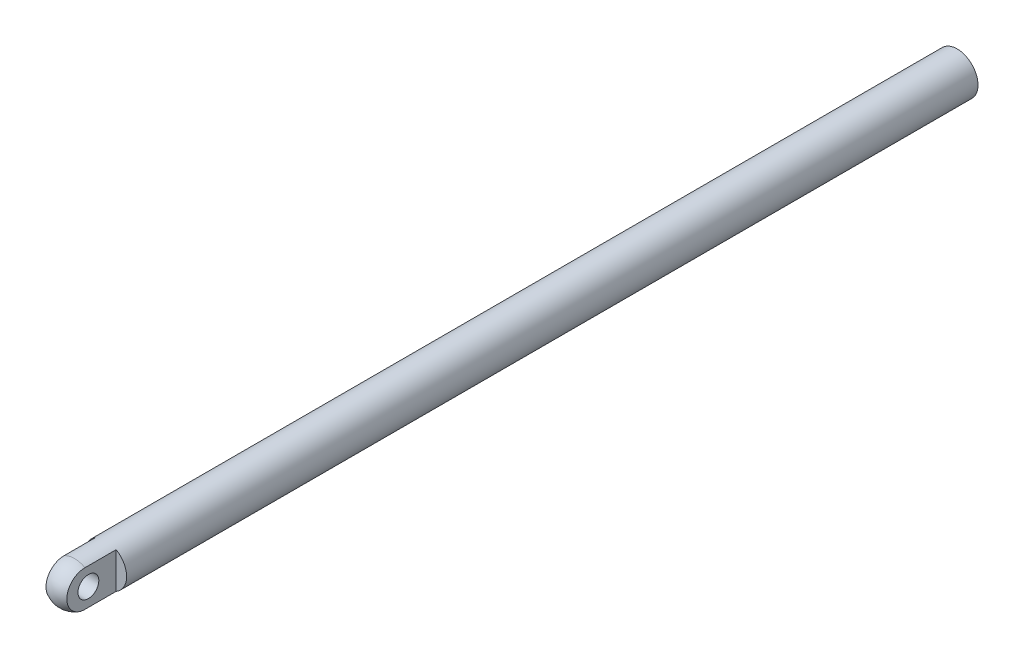
ISO-10303-21;
HEADER;
FILE_DESCRIPTION(('STEP AP214'),'2;1');
FILE_NAME('part.step','',(''),(''),'','','');
FILE_SCHEMA(('AUTOMOTIVE_DESIGN { 1 0 10303 214 1 1 1 1 }'));
ENDSEC;
DATA;
#1=APPLICATION_CONTEXT('core data for automotive mechanical design processes');
#2=APPLICATION_PROTOCOL_DEFINITION('international standard','automotive_design',2000,#1);
#3=PRODUCT_CONTEXT('',#1,'mechanical');
#4=PRODUCT('Part','Part','',(#3));
#5=PRODUCT_RELATED_PRODUCT_CATEGORY('part','',(#4));
#6=PRODUCT_DEFINITION_FORMATION('','',#4);
#7=PRODUCT_DEFINITION_CONTEXT('part definition',#1,'design');
#8=PRODUCT_DEFINITION('design','',#6,#7);
#9=PRODUCT_DEFINITION_SHAPE('','',#8);
#10=(LENGTH_UNIT() NAMED_UNIT(*) SI_UNIT(.MILLI.,.METRE.));
#11=(NAMED_UNIT(*) PLANE_ANGLE_UNIT() SI_UNIT($,.RADIAN.));
#12=(NAMED_UNIT(*) SI_UNIT($,.STERADIAN.) SOLID_ANGLE_UNIT());
#13=UNCERTAINTY_MEASURE_WITH_UNIT(LENGTH_MEASURE(1.E-05),#10,'distance_accuracy_value','');
#14=(GEOMETRIC_REPRESENTATION_CONTEXT(3) GLOBAL_UNCERTAINTY_ASSIGNED_CONTEXT((#13)) GLOBAL_UNIT_ASSIGNED_CONTEXT((#10,
#11,#12)) REPRESENTATION_CONTEXT('',''));
#15=CARTESIAN_POINT('',(0.,0.,0.));
#16=DIRECTION('',(0.,0.,1.));
#17=DIRECTION('',(1.,0.,0.));
#18=AXIS2_PLACEMENT_3D('',#15,#16,#17);
#19=CARTESIAN_POINT('',(0.,0.,897.));
#20=DIRECTION('',(0.,0.,-1.));
#21=DIRECTION('',(-1.,0.,0.));
#22=AXIS2_PLACEMENT_3D('',#19,#20,#21);
#23=CYLINDRICAL_SURFACE('',#22,20.7);
#24=DIRECTION('',(0.,0.,-1.));
#25=VECTOR('',#24,1.);
#26=CARTESIAN_POINT('',(10.35,-17.9267258583379,897.));
#27=LINE('',#26,#25);
#28=CARTESIAN_POINT('',(10.35,-17.9267258583379,845.25));
#29=VERTEX_POINT('',#28);
#30=CARTESIAN_POINT('',(10.35,-17.9267258583379,876.3));
#31=VERTEX_POINT('',#30);
#32=EDGE_CURVE('E82',#29,#31,#27,.F.);
#33=ORIENTED_EDGE('',*,*,#32,.T.);
#34=CARTESIAN_POINT('',(0.,0.,876.3));
#35=DIRECTION('',(0.,0.,-1.));
#36=DIRECTION('',(-1.,0.,0.));
#37=AXIS2_PLACEMENT_3D('',#34,#35,#36);
#38=CIRCLE('',#37,20.7);
#39=CARTESIAN_POINT('',(-10.35,-17.9267258583379,876.3));
#40=VERTEX_POINT('',#39);
#41=EDGE_CURVE('E111',#31,#40,#38,.T.);
#42=ORIENTED_EDGE('',*,*,#41,.T.);
#43=DIRECTION('',(0.,0.,-1.));
#44=VECTOR('',#43,1.);
#45=CARTESIAN_POINT('',(-10.35,-17.9267258583379,897.));
#46=LINE('',#45,#44);
#47=CARTESIAN_POINT('',(-10.35,-17.9267258583379,845.25));
#48=VERTEX_POINT('',#47);
#49=EDGE_CURVE('E103',#40,#48,#46,.T.);
#50=ORIENTED_EDGE('',*,*,#49,.T.);
#51=CARTESIAN_POINT('',(0.,0.,845.25));
#52=DIRECTION('',(0.,0.,1.));
#53=DIRECTION('',(1.,0.,0.));
#54=AXIS2_PLACEMENT_3D('',#51,#52,#53);
#55=CIRCLE('',#54,20.7);
#56=CARTESIAN_POINT('',(-10.35,17.9267258583379,845.25));
#57=VERTEX_POINT('',#56);
#58=EDGE_CURVE('E88',#57,#48,#55,.T.);
#59=ORIENTED_EDGE('',*,*,#58,.F.);
#60=DIRECTION('',(0.,0.,-1.));
#61=VECTOR('',#60,1.);
#62=CARTESIAN_POINT('',(-10.35,17.9267258583379,897.));
#63=LINE('',#62,#61);
#64=CARTESIAN_POINT('',(-10.35,17.9267258583379,876.3));
#65=VERTEX_POINT('',#64);
#66=EDGE_CURVE('E101',#57,#65,#63,.F.);
#67=ORIENTED_EDGE('',*,*,#66,.T.);
#68=CARTESIAN_POINT('',(0.,0.,876.3));
#69=DIRECTION('',(0.,0.,-1.));
#70=DIRECTION('',(-1.,0.,0.));
#71=AXIS2_PLACEMENT_3D('',#68,#69,#70);
#72=CIRCLE('',#71,20.7);
#73=CARTESIAN_POINT('',(10.35,17.9267258583379,876.3));
#74=VERTEX_POINT('',#73);
#75=EDGE_CURVE('E77',#65,#74,#72,.T.);
#76=ORIENTED_EDGE('',*,*,#75,.T.);
#77=DIRECTION('',(0.,0.,-1.));
#78=VECTOR('',#77,1.);
#79=CARTESIAN_POINT('',(10.35,17.9267258583379,897.));
#80=LINE('',#79,#78);
#81=CARTESIAN_POINT('',(10.35,17.9267258583379,845.25));
#82=VERTEX_POINT('',#81);
#83=EDGE_CURVE('E72',#74,#82,#80,.T.);
#84=ORIENTED_EDGE('',*,*,#83,.T.);
#85=CARTESIAN_POINT('',(0.,0.,845.25));
#86=DIRECTION('',(0.,0.,-1.));
#87=DIRECTION('',(-1.,0.,0.));
#88=AXIS2_PLACEMENT_3D('',#85,#86,#87);
#89=CIRCLE('',#88,20.7);
#90=EDGE_CURVE('E76',#82,#29,#89,.T.);
#91=ORIENTED_EDGE('',*,*,#90,.T.);
#92=EDGE_LOOP('',(#33,#42,#50,#59,#67,#76,#84,#91));
#93=FACE_BOUND('',#92,.T.);
#94=CARTESIAN_POINT('',(0.,0.,0.));
#95=DIRECTION('',(0.,0.,1.));
#96=DIRECTION('',(1.,0.,0.));
#97=AXIS2_PLACEMENT_3D('',#94,#95,#96);
#98=CIRCLE('',#97,20.7);
#99=CARTESIAN_POINT('',(20.7,0.,0.));
#100=VERTEX_POINT('',#99);
#101=EDGE_CURVE('E105',#100,#100,#98,.T.);
#102=ORIENTED_EDGE('',*,*,#101,.T.);
#103=EDGE_LOOP('',(#102));
#104=FACE_BOUND('',#103,.T.);
#105=ADVANCED_FACE('F33',(#93,#104),#23,.T.);
#106=CARTESIAN_POINT('',(0.,0.,0.));
#107=DIRECTION('',(0.,0.,1.));
#108=DIRECTION('',(1.,0.,0.));
#109=AXIS2_PLACEMENT_3D('',#106,#107,#108);
#110=PLANE('',#109);
#111=ORIENTED_EDGE('',*,*,#101,.F.);
#112=EDGE_LOOP('',(#111));
#113=FACE_BOUND('',#112,.T.);
#114=ADVANCED_FACE('F125',(#113),#110,.F.);
#115=CARTESIAN_POINT('',(0.,0.,845.25));
#116=DIRECTION('',(0.,0.,1.));
#117=DIRECTION('',(1.,0.,0.));
#118=AXIS2_PLACEMENT_3D('',#115,#116,#117);
#119=PLANE('',#118);
#120=ORIENTED_EDGE('',*,*,#58,.T.);
#121=DIRECTION('',(0.,1.,0.));
#122=VECTOR('',#121,1.);
#123=CARTESIAN_POINT('',(-10.35,20.7,845.25));
#124=LINE('',#123,#122);
#125=EDGE_CURVE('E81',#48,#57,#124,.T.);
#126=ORIENTED_EDGE('',*,*,#125,.T.);
#127=EDGE_LOOP('',(#120,#126));
#128=FACE_BOUND('',#127,.T.);
#129=ADVANCED_FACE('F116',(#128),#119,.T.);
#130=CARTESIAN_POINT('',(-10.35,20.7,845.25));
#131=DIRECTION('',(1.,0.,0.));
#132=DIRECTION('',(0.,0.,-1.));
#133=AXIS2_PLACEMENT_3D('',#130,#131,#132);
#134=PLANE('',#133);
#135=CARTESIAN_POINT('',(-10.35,0.,872.85));
#136=DIRECTION('',(1.,0.,0.));
#137=DIRECTION('',(0.,0.,-1.));
#138=AXIS2_PLACEMENT_3D('',#135,#136,#137);
#139=CIRCLE('',#138,10.3499999999999);
#140=CARTESIAN_POINT('',(-10.35,0.,862.5));
#141=VERTEX_POINT('',#140);
#142=EDGE_CURVE('E91',#141,#141,#139,.T.);
#143=ORIENTED_EDGE('',*,*,#142,.T.);
#144=EDGE_LOOP('',(#143));
#145=FACE_BOUND('',#144,.T.);
#146=ORIENTED_EDGE('',*,*,#49,.F.);
#147=CARTESIAN_POINT('',(-10.35,0.,876.3));
#148=DIRECTION('',(1.,0.,0.));
#149=DIRECTION('',(0.,0.,-1.));
#150=AXIS2_PLACEMENT_3D('',#147,#148,#149);
#151=CIRCLE('',#150,17.9267258583379);
#152=EDGE_CURVE('E41',#40,#65,#151,.F.);
#153=ORIENTED_EDGE('',*,*,#152,.T.);
#154=ORIENTED_EDGE('',*,*,#66,.F.);
#155=ORIENTED_EDGE('',*,*,#125,.F.);
#156=EDGE_LOOP('',(#146,#153,#154,#155));
#157=FACE_BOUND('',#156,.T.);
#158=ADVANCED_FACE('F114',(#145,#157),#134,.F.);
#159=CARTESIAN_POINT('',(0.,0.,845.25));
#160=DIRECTION('',(0.,0.,-1.));
#161=DIRECTION('',(-1.,0.,0.));
#162=AXIS2_PLACEMENT_3D('',#159,#160,#161);
#163=PLANE('',#162);
#164=DIRECTION('',(0.,-1.,0.));
#165=VECTOR('',#164,1.);
#166=CARTESIAN_POINT('',(10.35,20.7,845.25));
#167=LINE('',#166,#165);
#168=EDGE_CURVE('E87',#82,#29,#167,.T.);
#169=ORIENTED_EDGE('',*,*,#168,.T.);
#170=ORIENTED_EDGE('',*,*,#90,.F.);
#171=EDGE_LOOP('',(#169,#170));
#172=FACE_BOUND('',#171,.T.);
#173=ADVANCED_FACE('F86',(#172),#163,.F.);
#174=CARTESIAN_POINT('',(10.35,20.7,845.25));
#175=DIRECTION('',(-1.,0.,0.));
#176=DIRECTION('',(0.,0.,1.));
#177=AXIS2_PLACEMENT_3D('',#174,#175,#176);
#178=PLANE('',#177);
#179=CARTESIAN_POINT('',(10.35,0.,872.85));
#180=DIRECTION('',(1.,0.,0.));
#181=DIRECTION('',(0.,0.,-1.));
#182=AXIS2_PLACEMENT_3D('',#179,#180,#181);
#183=CIRCLE('',#182,10.3499999999999);
#184=CARTESIAN_POINT('',(10.35,0.,862.5));
#185=VERTEX_POINT('',#184);
#186=EDGE_CURVE('E95',#185,#185,#183,.T.);
#187=ORIENTED_EDGE('',*,*,#186,.F.);
#188=EDGE_LOOP('',(#187));
#189=FACE_BOUND('',#188,.T.);
#190=ORIENTED_EDGE('',*,*,#83,.F.);
#191=CARTESIAN_POINT('',(10.35,0.,876.3));
#192=DIRECTION('',(-1.,0.,0.));
#193=DIRECTION('',(0.,0.,1.));
#194=AXIS2_PLACEMENT_3D('',#191,#192,#193);
#195=CIRCLE('',#194,17.9267258583379);
#196=EDGE_CURVE('E11',#74,#31,#195,.F.);
#197=ORIENTED_EDGE('',*,*,#196,.T.);
#198=ORIENTED_EDGE('',*,*,#32,.F.);
#199=ORIENTED_EDGE('',*,*,#168,.F.);
#200=EDGE_LOOP('',(#190,#197,#198,#199));
#201=FACE_BOUND('',#200,.T.);
#202=ADVANCED_FACE('F90',(#189,#201),#178,.F.);
#203=CARTESIAN_POINT('',(-41.4,0.,872.85));
#204=DIRECTION('',(1.,0.,0.));
#205=DIRECTION('',(0.,0.,-1.));
#206=AXIS2_PLACEMENT_3D('',#203,#204,#205);
#207=CYLINDRICAL_SURFACE('',#206,10.3499999999999);
#208=ORIENTED_EDGE('',*,*,#186,.T.);
#209=EDGE_LOOP('',(#208));
#210=FACE_BOUND('',#209,.T.);
#211=ORIENTED_EDGE('',*,*,#142,.F.);
#212=EDGE_LOOP('',(#211));
#213=FACE_BOUND('',#212,.T.);
#214=ADVANCED_FACE('F118',(#210,#213),#207,.F.);
#215=CARTESIAN_POINT('',(0.,0.,876.3));
#216=DIRECTION('',(0.,0.,1.));
#217=DIRECTION('',(1.,0.,0.));
#218=AXIS2_PLACEMENT_3D('',#215,#216,#217);
#219=SPHERICAL_SURFACE('',#218,20.7);
#220=ORIENTED_EDGE('',*,*,#152,.F.);
#221=ORIENTED_EDGE('',*,*,#41,.F.);
#222=ORIENTED_EDGE('',*,*,#196,.F.);
#223=ORIENTED_EDGE('',*,*,#75,.F.);
#224=EDGE_LOOP('',(#220,#221,#222,#223));
#225=FACE_BOUND('',#224,.T.);
#226=ADVANCED_FACE('F35',(#225),#219,.T.);
#227=CLOSED_SHELL('',(#105,#114,#129,#158,#173,#202,#214,#226));
#228=MANIFOLD_SOLID_BREP('B2',#227);
#229=ADVANCED_BREP_SHAPE_REPRESENTATION('',(#18,#228),#14);
#230=SHAPE_DEFINITION_REPRESENTATION(#9,#229);
ENDSEC;
END-ISO-10303-21;
